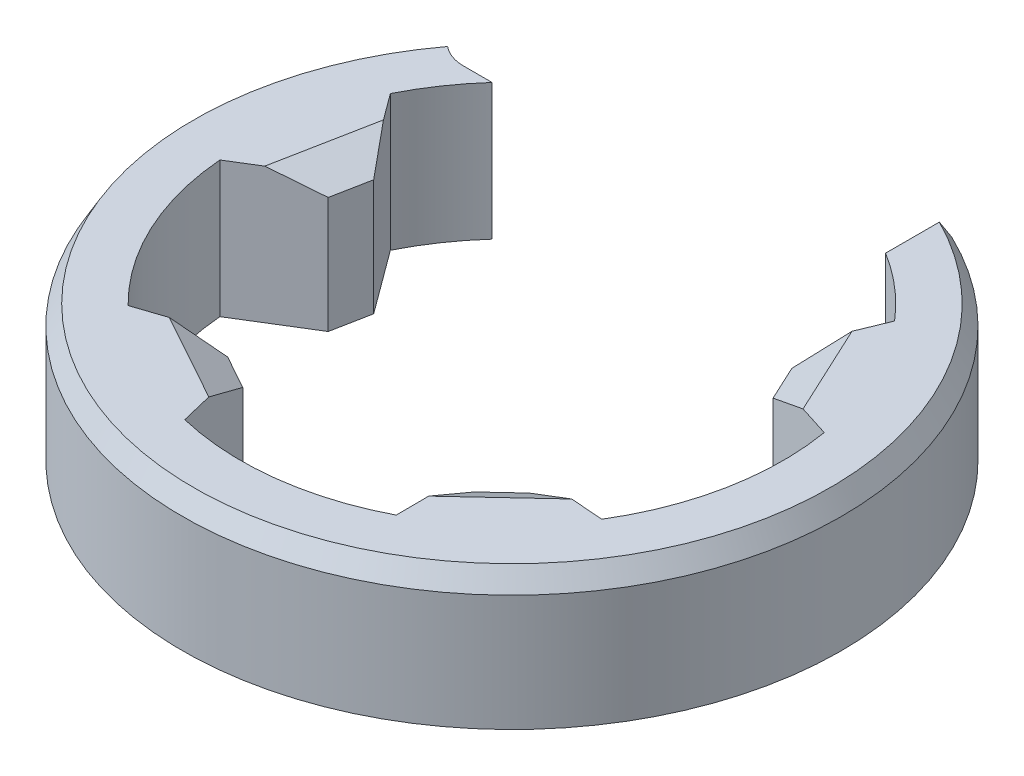
ISO-10303-21;
HEADER;
FILE_DESCRIPTION(('STEP AP214'),'2;1');
FILE_NAME('part.step','',(''),(''),'','','');
FILE_SCHEMA(('AUTOMOTIVE_DESIGN { 1 0 10303 214 1 1 1 1 }'));
ENDSEC;
DATA;
#1=APPLICATION_CONTEXT('core data for automotive mechanical design processes');
#2=APPLICATION_PROTOCOL_DEFINITION('international standard','automotive_design',2000,#1);
#3=PRODUCT_CONTEXT('',#1,'mechanical');
#4=PRODUCT('Part','Part','',(#3));
#5=PRODUCT_RELATED_PRODUCT_CATEGORY('part','',(#4));
#6=PRODUCT_DEFINITION_FORMATION('','',#4);
#7=PRODUCT_DEFINITION_CONTEXT('part definition',#1,'design');
#8=PRODUCT_DEFINITION('design','',#6,#7);
#9=PRODUCT_DEFINITION_SHAPE('','',#8);
#10=(LENGTH_UNIT() NAMED_UNIT(*) SI_UNIT(.MILLI.,.METRE.));
#11=(NAMED_UNIT(*) PLANE_ANGLE_UNIT() SI_UNIT($,.RADIAN.));
#12=(NAMED_UNIT(*) SI_UNIT($,.STERADIAN.) SOLID_ANGLE_UNIT());
#13=UNCERTAINTY_MEASURE_WITH_UNIT(LENGTH_MEASURE(1.E-05),#10,'distance_accuracy_value','');
#14=(GEOMETRIC_REPRESENTATION_CONTEXT(3) GLOBAL_UNCERTAINTY_ASSIGNED_CONTEXT((#13)) GLOBAL_UNIT_ASSIGNED_CONTEXT((#10,
#11,#12)) REPRESENTATION_CONTEXT('',''));
#15=CARTESIAN_POINT('',(0.,0.,0.));
#16=DIRECTION('',(0.,0.,1.));
#17=DIRECTION('',(1.,0.,0.));
#18=AXIS2_PLACEMENT_3D('',#15,#16,#17);
#19=CARTESIAN_POINT('',(22.3156312445688,56.9484850412162,624.040224750273));
#20=DIRECTION('',(0.,1.,0.));
#21=DIRECTION('',(-0.681998360062499,0.,-0.73135370161917));
#22=AXIS2_PLACEMENT_3D('',#19,#20,#21);
#23=PLANE('',#22);
#24=CARTESIAN_POINT('',(22.3156312445688,56.9484850412162,624.040224750273));
#25=DIRECTION('',(0.,-1.,0.));
#26=DIRECTION('',(-0.681998360062499,0.,-0.73135370161917));
#27=AXIS2_PLACEMENT_3D('',#24,#25,#26);
#28=CIRCLE('',#27,32.8452994616208);
#29=CARTESIAN_POINT('',(37.0656312445709,56.9484850412162,594.693143179468));
#30=VERTEX_POINT('',#29);
#31=CARTESIAN_POINT('',(-3.98772197538471,56.9484850412162,604.369248513444));
#32=VERTEX_POINT('',#31);
#33=EDGE_CURVE('E401',#30,#32,#28,.T.);
#34=ORIENTED_EDGE('',*,*,#33,.F.);
#35=DIRECTION('',(0.,0.,1.));
#36=VECTOR('',#35,1.);
#37=CARTESIAN_POINT('',(37.0656312445709,56.9484850412162,624.040224750273));
#38=LINE('',#37,#36);
#39=CARTESIAN_POINT('',(37.0656312445709,56.9484850412162,600.240277271341));
#40=VERTEX_POINT('',#39);
#41=EDGE_CURVE('E51',#30,#40,#38,.T.);
#42=ORIENTED_EDGE('',*,*,#41,.T.);
#43=CARTESIAN_POINT('',(22.3156312445688,56.9484850412162,624.040224750273));
#44=DIRECTION('',(0.,-1.,0.));
#45=DIRECTION('',(-0.681998360062499,0.,-0.73135370161917));
#46=AXIS2_PLACEMENT_3D('',#43,#44,#45);
#47=CIRCLE('',#46,28.);
#48=CARTESIAN_POINT('',(43.5953161836582,56.9484850412162,605.842010307832));
#49=VERTEX_POINT('',#48);
#50=EDGE_CURVE('E265',#40,#49,#47,.T.);
#51=ORIENTED_EDGE('',*,*,#50,.T.);
#52=DIRECTION('',(-0.380734183877205,0.,0.924684530652135));
#53=VECTOR('',#52,1.);
#54=CARTESIAN_POINT('',(40.5028582488572,56.9484850412162,613.352625679645));
#55=LINE('',#54,#53);
#56=CARTESIAN_POINT('',(42.3137816287783,56.9484850412162,608.954457859365));
#57=VERTEX_POINT('',#56);
#58=EDGE_CURVE('E267',#49,#57,#55,.T.);
#59=ORIENTED_EDGE('',*,*,#58,.T.);
#60=DIRECTION('',(-0.422618261740715,0.,-0.906307787036643));
#61=VECTOR('',#60,1.);
#62=CARTESIAN_POINT('',(44.5201720269668,56.9484850412162,613.686077337626));
#63=LINE('',#62,#61);
#64=CARTESIAN_POINT('',(46.7265624251555,56.9484850412162,618.417696815887));
#65=VERTEX_POINT('',#64);
#66=EDGE_CURVE('E368',#65,#57,#63,.T.);
#67=ORIENTED_EDGE('',*,*,#66,.F.);
#68=DIRECTION('',(0.953080662324528,0.,0.302716453307446));
#69=VECTOR('',#68,1.);
#70=CARTESIAN_POINT('',(42.19333129582,56.9484850412162,616.977856827792));
#71=LINE('',#70,#69);
#72=CARTESIAN_POINT('',(49.9345901097687,56.9484850412162,619.436627113382));
#73=VERTEX_POINT('',#72);
#74=EDGE_CURVE('E270',#65,#73,#71,.T.);
#75=ORIENTED_EDGE('',*,*,#74,.T.);
#76=CARTESIAN_POINT('',(22.3156312445688,56.9484850412162,624.040224750273));
#77=DIRECTION('',(0.,-1.,0.));
#78=DIRECTION('',(-0.681998360062499,0.,-0.73135370161917));
#79=AXIS2_PLACEMENT_3D('',#76,#77,#78);
#80=CIRCLE('',#79,28.);
#81=CARTESIAN_POINT('',(46.1989459561127,56.9484850412162,638.654850246308));
#82=VERTEX_POINT('',#81);
#83=EDGE_CURVE('E273',#73,#82,#80,.T.);
#84=ORIENTED_EDGE('',*,*,#83,.T.);
#85=DIRECTION('',(-0.997080581551572,0.,-0.0763564921455948));
#86=VECTOR('',#85,1.);
#87=CARTESIAN_POINT('',(38.1003042091196,56.9484850412162,638.034655764151));
#88=LINE('',#87,#86);
#89=CARTESIAN_POINT('',(42.8428164742633,56.9484850412162,638.397837644557));
#90=VERTEX_POINT('',#89);
#91=EDGE_CURVE('E240',#82,#90,#88,.T.);
#92=ORIENTED_EDGE('',*,*,#91,.T.);
#93=DIRECTION('',(0.73135370161917,0.,-0.681998360062499));
#94=VECTOR('',#93,1.);
#95=CARTESIAN_POINT('',(39.0245910661,56.9484850412162,641.958390439943));
#96=LINE('',#95,#94);
#97=CARTESIAN_POINT('',(35.2063656579367,56.9484850412162,645.51894323533));
#98=VERTEX_POINT('',#97);
#99=EDGE_CURVE('E365',#98,#90,#96,.T.);
#100=ORIENTED_EDGE('',*,*,#99,.F.);
#101=DIRECTION('',(0.00661766616061377,0.,0.999978103007555));
#102=VECTOR('',#101,1.);
#103=CARTESIAN_POINT('',(35.174889402643,56.9484850412162,640.762649204401));
#104=LINE('',#103,#102);
#105=CARTESIAN_POINT('',(35.2286404318252,56.9484850412162,648.884825647246));
#106=VERTEX_POINT('',#105);
#107=EDGE_CURVE('E243',#98,#106,#104,.T.);
#108=ORIENTED_EDGE('',*,*,#107,.T.);
#109=CARTESIAN_POINT('',(22.3156312445688,56.9484850412162,624.040224750273));
#110=DIRECTION('',(0.,-1.,0.));
#111=DIRECTION('',(-0.681998360062499,0.,-0.73135370161917));
#112=AXIS2_PLACEMENT_3D('',#109,#110,#111);
#113=CIRCLE('',#112,28.);
#114=CARTESIAN_POINT('',(15.796646561224,56.9484850412162,651.270774482115));
#115=VERTEX_POINT('',#114);
#116=EDGE_CURVE('E247',#106,#115,#113,.T.);
#117=ORIENTED_EDGE('',*,*,#116,.T.);
#118=DIRECTION('',(-0.235495505044191,0.,-0.971875438059828));
#119=VECTOR('',#118,1.);
#120=CARTESIAN_POINT('',(13.8838686336745,56.9484850412162,643.376857840694));
#121=LINE('',#120,#119);
#122=CARTESIAN_POINT('',(15.0039790256755,56.9484850412162,647.999484407163));
#123=VERTEX_POINT('',#122);
#124=EDGE_CURVE('E250',#115,#123,#121,.T.);
#125=ORIENTED_EDGE('',*,*,#124,.T.);
#126=DIRECTION('',(0.874619707139393,0.,0.484809620246343));
#127=VECTOR('',#126,1.);
#128=CARTESIAN_POINT('',(10.4377955485333,56.9484850412162,645.468407575189));
#129=LINE('',#128,#127);
#130=CARTESIAN_POINT('',(5.87161207139153,56.9484850412162,642.937330743215));
#131=VERTEX_POINT('',#130);
#132=EDGE_CURVE('E362',#131,#123,#129,.T.);
#133=ORIENTED_EDGE('',*,*,#132,.F.);
#134=DIRECTION('',(-0.948990719711073,0.,0.315304002356868));
#135=VECTOR('',#134,1.);
#136=CARTESIAN_POINT('',(10.3853898051169,56.9484850412162,641.437619359708));
#137=LINE('',#136,#135);
#138=CARTESIAN_POINT('',(2.67735095413307,56.9484850412162,643.99863017842));
#139=VERTEX_POINT('',#138);
#140=EDGE_CURVE('E253',#131,#139,#137,.T.);
#141=ORIENTED_EDGE('',*,*,#140,.T.);
#142=CARTESIAN_POINT('',(22.3156312445688,56.9484850412162,624.040224750273));
#143=DIRECTION('',(0.,-1.,0.));
#144=DIRECTION('',(-0.681998360062499,0.,-0.73135370161917));
#145=AXIS2_PLACEMENT_3D('',#142,#143,#144);
#146=CIRCLE('',#145,28.);
#147=CARTESIAN_POINT('',(-5.59663757342227,56.9484850412162,626.255004520861));
#148=VERTEX_POINT('',#147);
#149=EDGE_CURVE('E256',#139,#148,#146,.T.);
#150=ORIENTED_EDGE('',*,*,#149,.T.);
#151=DIRECTION('',(0.85153635523644,0.,-0.524295561406578));
#152=VECTOR('',#151,1.);
#153=CARTESIAN_POINT('',(1.31984240141464,56.9484850412162,621.996490214261));
#154=LINE('',#153,#152);
#155=CARTESIAN_POINT('',(-2.73040357032062,56.9484850412162,624.490248669232));
#156=VERTEX_POINT('',#155);
#157=EDGE_CURVE('E259',#148,#156,#154,.T.);
#158=ORIENTED_EDGE('',*,*,#157,.T.);
#159=DIRECTION('',(-0.190808995376548,0.,0.981627183447664));
#160=VECTOR('',#159,1.);
#161=CARTESIAN_POINT('',(-1.73423474989914,56.9484850412162,619.365404363548));
#162=LINE('',#161,#160);
#163=CARTESIAN_POINT('',(-0.73806592947756,56.9484850412162,614.240560057864));
#164=VERTEX_POINT('',#163);
#165=EDGE_CURVE('E371',#164,#156,#162,.T.);
#166=ORIENTED_EDGE('',*,*,#165,.F.);
#167=DIRECTION('',(-0.59312618595028,0.,-0.80510951276213));
#168=VECTOR('',#167,1.);
#169=CARTESIAN_POINT('',(2.08307838292082,56.9484850412162,618.069981480471));
#170=LINE('',#169,#168);
#171=CARTESIAN_POINT('',(-2.73450264277403,56.9484850412162,611.530596769146));
#172=VERTEX_POINT('',#171);
#173=EDGE_CURVE('E262',#164,#172,#170,.T.);
#174=ORIENTED_EDGE('',*,*,#173,.T.);
#175=CARTESIAN_POINT('',(22.3156312445688,56.9484850412162,624.040224750273));
#176=DIRECTION('',(0.,-1.,0.));
#177=DIRECTION('',(-0.681998360062499,0.,-0.73135370161917));
#178=AXIS2_PLACEMENT_3D('',#175,#176,#177);
#179=CIRCLE('',#178,28.);
#180=CARTESIAN_POINT('',(1.52049960275995,56.9484850412162,605.290224750278));
#181=VERTEX_POINT('',#180);
#182=EDGE_CURVE('E230',#172,#181,#179,.T.);
#183=ORIENTED_EDGE('',*,*,#182,.T.);
#184=DIRECTION('',(-1.,0.,0.));
#185=VECTOR('',#184,1.);
#186=CARTESIAN_POINT('',(22.3156312445688,56.9484850412162,605.290224750278));
#187=LINE('',#186,#185);
#188=CARTESIAN_POINT('',(-1.43436875542909,56.9484850412162,605.290224750278));
#189=VERTEX_POINT('',#188);
#190=EDGE_CURVE('E223',#181,#189,#187,.T.);
#191=ORIENTED_EDGE('',*,*,#190,.T.);
#192=CARTESIAN_POINT('',(-1.43436875542907,56.9484850412162,601.290224750278));
#193=DIRECTION('',(0.,1.,0.));
#194=DIRECTION('',(0.,0.,1.));
#195=AXIS2_PLACEMENT_3D('',#192,#193,#194);
#196=CIRCLE('',#195,4.);
#197=EDGE_CURVE('E208',#189,#32,#196,.F.);
#198=ORIENTED_EDGE('',*,*,#197,.T.);
#199=EDGE_LOOP('',(#34,#42,#51,#59,#67,#75,#84,#92,#100,#108,#117,#125,#133,#141,#150,#158,#166,
#174,#183,#191,#198));
#200=FACE_BOUND('',#199,.T.);
#201=ADVANCED_FACE('F35',(#200),#23,.T.);
#202=CARTESIAN_POINT('',(22.3156312445688,42.9484850412162,624.040224750273));
#203=DIRECTION('',(0.,1.,0.));
#204=DIRECTION('',(-0.681998360062499,0.,-0.73135370161917));
#205=AXIS2_PLACEMENT_3D('',#202,#203,#204);
#206=PLANE('',#205);
#207=DIRECTION('',(0.,0.,1.));
#208=VECTOR('',#207,1.);
#209=CARTESIAN_POINT('',(37.0656312445709,42.9484850412162,624.040224750273));
#210=LINE('',#209,#208);
#211=CARTESIAN_POINT('',(37.0656312445709,42.9484850412162,593.406297480008));
#212=VERTEX_POINT('',#211);
#213=CARTESIAN_POINT('',(37.0656312445709,42.9484850412162,600.240277271341));
#214=VERTEX_POINT('',#213);
#215=EDGE_CURVE('E543',#212,#214,#210,.T.);
#216=ORIENTED_EDGE('',*,*,#215,.F.);
#217=CARTESIAN_POINT('',(22.3156312445688,42.9484850412162,624.040224750273));
#218=DIRECTION('',(0.,-1.,0.));
#219=DIRECTION('',(-0.681998360062499,0.,-0.73135370161917));
#220=AXIS2_PLACEMENT_3D('',#217,#218,#219);
#221=CIRCLE('',#220,34.);
#222=CARTESIAN_POINT('',(-4.77325715483285,42.9484850412162,603.492910441956));
#223=VERTEX_POINT('',#222);
#224=EDGE_CURVE('E354',#212,#223,#221,.T.);
#225=ORIENTED_EDGE('',*,*,#224,.T.);
#226=CARTESIAN_POINT('',(-1.43436875542905,42.9484850412162,601.290224750278));
#227=DIRECTION('',(0.,1.,0.));
#228=DIRECTION('',(0.,0.,1.));
#229=AXIS2_PLACEMENT_3D('',#226,#227,#228);
#230=CIRCLE('',#229,4.);
#231=CARTESIAN_POINT('',(-1.43436875542907,42.9484850412162,605.290224750278));
#232=VERTEX_POINT('',#231);
#233=EDGE_CURVE('E219',#232,#223,#230,.F.);
#234=ORIENTED_EDGE('',*,*,#233,.F.);
#235=DIRECTION('',(-1.,0.,0.));
#236=VECTOR('',#235,1.);
#237=CARTESIAN_POINT('',(22.3156312445688,42.9484850412162,605.290224750278));
#238=LINE('',#237,#236);
#239=CARTESIAN_POINT('',(1.52049960275995,42.9484850412162,605.290224750278));
#240=VERTEX_POINT('',#239);
#241=EDGE_CURVE('E225',#240,#232,#238,.T.);
#242=ORIENTED_EDGE('',*,*,#241,.F.);
#243=CARTESIAN_POINT('',(22.3156312445688,42.9484850412162,624.040224750273));
#244=DIRECTION('',(0.,-1.,0.));
#245=DIRECTION('',(-0.681998360062499,0.,-0.73135370161917));
#246=AXIS2_PLACEMENT_3D('',#243,#244,#245);
#247=CIRCLE('',#246,28.);
#248=CARTESIAN_POINT('',(-2.73450264277403,42.9484850412162,611.530596769146));
#249=VERTEX_POINT('',#248);
#250=EDGE_CURVE('E306',#249,#240,#247,.T.);
#251=ORIENTED_EDGE('',*,*,#250,.F.);
#252=DIRECTION('',(-0.59312618595028,0.,-0.80510951276213));
#253=VECTOR('',#252,1.);
#254=CARTESIAN_POINT('',(2.08307838292082,42.9484850412162,618.069981480471));
#255=LINE('',#254,#253);
#256=CARTESIAN_POINT('',(2.08307838292082,42.9484850412162,618.069981480471));
#257=VERTEX_POINT('',#256);
#258=EDGE_CURVE('E303',#257,#249,#255,.T.);
#259=ORIENTED_EDGE('',*,*,#258,.F.);
#260=DIRECTION('',(0.190808995376548,0.,-0.981627183447663));
#261=VECTOR('',#260,1.);
#262=CARTESIAN_POINT('',(2.08307838292082,42.9484850412162,618.069981480471));
#263=LINE('',#262,#261);
#264=CARTESIAN_POINT('',(1.31984240141464,42.9484850412162,621.996490214261));
#265=VERTEX_POINT('',#264);
#266=EDGE_CURVE('E300',#265,#257,#263,.T.);
#267=ORIENTED_EDGE('',*,*,#266,.F.);
#268=DIRECTION('',(0.85153635523644,0.,-0.524295561406578));
#269=VECTOR('',#268,1.);
#270=CARTESIAN_POINT('',(1.31984240141464,42.9484850412162,621.996490214261));
#271=LINE('',#270,#269);
#272=CARTESIAN_POINT('',(-5.59663757342227,42.9484850412162,626.255004520861));
#273=VERTEX_POINT('',#272);
#274=EDGE_CURVE('E297',#273,#265,#271,.T.);
#275=ORIENTED_EDGE('',*,*,#274,.F.);
#276=CARTESIAN_POINT('',(22.3156312445688,42.9484850412162,624.040224750273));
#277=DIRECTION('',(0.,-1.,0.));
#278=DIRECTION('',(-0.681998360062499,0.,-0.73135370161917));
#279=AXIS2_PLACEMENT_3D('',#276,#277,#278);
#280=CIRCLE('',#279,28.);
#281=CARTESIAN_POINT('',(2.67735095413307,42.9484850412162,643.99863017842));
#282=VERTEX_POINT('',#281);
#283=EDGE_CURVE('E294',#282,#273,#280,.T.);
#284=ORIENTED_EDGE('',*,*,#283,.F.);
#285=DIRECTION('',(-0.948990719711073,0.,0.315304002356868));
#286=VECTOR('',#285,1.);
#287=CARTESIAN_POINT('',(10.3853898051169,42.9484850412162,641.437619359708));
#288=LINE('',#287,#286);
#289=CARTESIAN_POINT('',(10.3853898051169,42.9484850412162,641.437619359708));
#290=VERTEX_POINT('',#289);
#291=EDGE_CURVE('E291',#290,#282,#288,.T.);
#292=ORIENTED_EDGE('',*,*,#291,.F.);
#293=DIRECTION('',(-0.874619707139393,0.,-0.484809620246343));
#294=VECTOR('',#293,1.);
#295=CARTESIAN_POINT('',(10.3853898051169,42.9484850412162,641.437619359708));
#296=LINE('',#295,#294);
#297=CARTESIAN_POINT('',(13.8838686336745,42.9484850412162,643.376857840694));
#298=VERTEX_POINT('',#297);
#299=EDGE_CURVE('E288',#298,#290,#296,.T.);
#300=ORIENTED_EDGE('',*,*,#299,.F.);
#301=DIRECTION('',(-0.235495505044191,0.,-0.971875438059828));
#302=VECTOR('',#301,1.);
#303=CARTESIAN_POINT('',(13.8838686336745,42.9484850412162,643.376857840694));
#304=LINE('',#303,#302);
#305=CARTESIAN_POINT('',(15.796646561224,42.9484850412162,651.270774482115));
#306=VERTEX_POINT('',#305);
#307=EDGE_CURVE('E285',#306,#298,#304,.T.);
#308=ORIENTED_EDGE('',*,*,#307,.F.);
#309=CARTESIAN_POINT('',(22.3156312445688,42.9484850412162,624.040224750273));
#310=DIRECTION('',(0.,-1.,0.));
#311=DIRECTION('',(-0.681998360062499,0.,-0.73135370161917));
#312=AXIS2_PLACEMENT_3D('',#309,#310,#311);
#313=CIRCLE('',#312,28.);
#314=CARTESIAN_POINT('',(35.2286404318252,42.9484850412162,648.884825647246));
#315=VERTEX_POINT('',#314);
#316=EDGE_CURVE('E282',#315,#306,#313,.T.);
#317=ORIENTED_EDGE('',*,*,#316,.F.);
#318=DIRECTION('',(0.00661766616061377,0.,0.999978103007555));
#319=VECTOR('',#318,1.);
#320=CARTESIAN_POINT('',(35.174889402643,42.9484850412162,640.762649204401));
#321=LINE('',#320,#319);
#322=CARTESIAN_POINT('',(35.174889402643,42.9484850412162,640.762649204401));
#323=VERTEX_POINT('',#322);
#324=EDGE_CURVE('E279',#323,#315,#321,.T.);
#325=ORIENTED_EDGE('',*,*,#324,.F.);
#326=DIRECTION('',(-0.73135370161917,0.,0.681998360062499));
#327=VECTOR('',#326,1.);
#328=CARTESIAN_POINT('',(35.174889402643,42.9484850412162,640.762649204401));
#329=LINE('',#328,#327);
#330=CARTESIAN_POINT('',(38.1003042091196,42.9484850412162,638.034655764151));
#331=VERTEX_POINT('',#330);
#332=EDGE_CURVE('E234',#331,#323,#329,.T.);
#333=ORIENTED_EDGE('',*,*,#332,.F.);
#334=DIRECTION('',(-0.997080581551572,0.,-0.0763564921455948));
#335=VECTOR('',#334,1.);
#336=CARTESIAN_POINT('',(38.1003042091196,42.9484850412162,638.034655764151));
#337=LINE('',#336,#335);
#338=CARTESIAN_POINT('',(46.1989459561127,42.9484850412162,638.654850246308));
#339=VERTEX_POINT('',#338);
#340=EDGE_CURVE('E231',#339,#331,#337,.T.);
#341=ORIENTED_EDGE('',*,*,#340,.F.);
#342=CARTESIAN_POINT('',(22.3156312445688,42.9484850412162,624.040224750273));
#343=DIRECTION('',(0.,-1.,0.));
#344=DIRECTION('',(-0.681998360062499,0.,-0.73135370161917));
#345=AXIS2_PLACEMENT_3D('',#342,#343,#344);
#346=CIRCLE('',#345,28.);
#347=CARTESIAN_POINT('',(49.9345901097687,42.9484850412162,619.436627113381));
#348=VERTEX_POINT('',#347);
#349=EDGE_CURVE('E244',#348,#339,#346,.T.);
#350=ORIENTED_EDGE('',*,*,#349,.F.);
#351=DIRECTION('',(0.953080662324528,0.,0.302716453307446));
#352=VECTOR('',#351,1.);
#353=CARTESIAN_POINT('',(42.19333129582,42.9484850412162,616.977856827792));
#354=LINE('',#353,#352);
#355=CARTESIAN_POINT('',(42.19333129582,42.9484850412162,616.977856827792));
#356=VERTEX_POINT('',#355);
#357=EDGE_CURVE('E317',#356,#348,#354,.T.);
#358=ORIENTED_EDGE('',*,*,#357,.F.);
#359=DIRECTION('',(0.422618261740715,0.,0.906307787036643));
#360=VECTOR('',#359,1.);
#361=CARTESIAN_POINT('',(42.19333129582,42.9484850412162,616.977856827792));
#362=LINE('',#361,#360);
#363=CARTESIAN_POINT('',(40.5028582488572,42.9484850412162,613.352625679645));
#364=VERTEX_POINT('',#363);
#365=EDGE_CURVE('E314',#364,#356,#362,.T.);
#366=ORIENTED_EDGE('',*,*,#365,.F.);
#367=DIRECTION('',(-0.380734183877205,0.,0.924684530652135));
#368=VECTOR('',#367,1.);
#369=CARTESIAN_POINT('',(40.5028582488572,42.9484850412162,613.352625679645));
#370=LINE('',#369,#368);
#371=CARTESIAN_POINT('',(43.5953161836582,42.9484850412162,605.842010307832));
#372=VERTEX_POINT('',#371);
#373=EDGE_CURVE('E311',#372,#364,#370,.T.);
#374=ORIENTED_EDGE('',*,*,#373,.F.);
#375=CARTESIAN_POINT('',(22.3156312445688,42.9484850412162,624.040224750273));
#376=DIRECTION('',(0.,-1.,0.));
#377=DIRECTION('',(-0.681998360062499,0.,-0.73135370161917));
#378=AXIS2_PLACEMENT_3D('',#375,#376,#377);
#379=CIRCLE('',#378,28.);
#380=EDGE_CURVE('E309',#214,#372,#379,.T.);
#381=ORIENTED_EDGE('',*,*,#380,.F.);
#382=EDGE_LOOP('',(#216,#225,#234,#242,#251,#259,#267,#275,#284,#292,#300,#308,#317,#325,#333,
#341,#350,#358,#366,#374,#381));
#383=FACE_BOUND('',#382,.T.);
#384=ADVANCED_FACE('F494',(#383),#206,.F.);
#385=CARTESIAN_POINT('',(22.3156312445688,56.9484850412162,624.040224750273));
#386=DIRECTION('',(0.,-1.,0.));
#387=DIRECTION('',(0.681998360062499,0.,0.73135370161917));
#388=AXIS2_PLACEMENT_3D('',#385,#386,#387);
#389=CYLINDRICAL_SURFACE('',#388,34.);
#390=DIRECTION('',(0.,-1.,0.));
#391=VECTOR('',#390,1.);
#392=CARTESIAN_POINT('',(37.0656312445709,56.9484850412162,593.406297480008));
#393=LINE('',#392,#391);
#394=CARTESIAN_POINT('',(37.0656312445709,54.9484850412162,593.406297480008));
#395=VERTEX_POINT('',#394);
#396=EDGE_CURVE('E218',#395,#212,#393,.T.);
#397=ORIENTED_EDGE('',*,*,#396,.F.);
#398=CARTESIAN_POINT('',(22.3156312445688,54.9484850412162,624.040224750273));
#399=DIRECTION('',(0.,-1.,0.));
#400=DIRECTION('',(-0.681998360062499,0.,-0.73135370161917));
#401=AXIS2_PLACEMENT_3D('',#398,#399,#400);
#402=CIRCLE('',#401,34.);
#403=CARTESIAN_POINT('',(-4.77325715483285,54.9484850412162,603.492910441956));
#404=VERTEX_POINT('',#403);
#405=EDGE_CURVE('E403',#404,#395,#402,.F.);
#406=ORIENTED_EDGE('',*,*,#405,.F.);
#407=DIRECTION('',(0.,-1.,0.));
#408=VECTOR('',#407,1.);
#409=CARTESIAN_POINT('',(-4.77325715483287,46.0534867100374,603.492910441956));
#410=LINE('',#409,#408);
#411=EDGE_CURVE('E59',#223,#404,#410,.F.);
#412=ORIENTED_EDGE('',*,*,#411,.F.);
#413=ORIENTED_EDGE('',*,*,#224,.F.);
#414=EDGE_LOOP('',(#397,#406,#412,#413));
#415=FACE_BOUND('',#414,.T.);
#416=ADVANCED_FACE('F447',(#415),#389,.T.);
#417=CARTESIAN_POINT('',(22.3156312445688,56.9484850412162,624.040224750273));
#418=DIRECTION('',(0.,-1.,0.));
#419=DIRECTION('',(0.681998360062499,0.,0.73135370161917));
#420=AXIS2_PLACEMENT_3D('',#417,#418,#419);
#421=CYLINDRICAL_SURFACE('',#420,28.);
#422=ORIENTED_EDGE('',*,*,#250,.T.);
#423=DIRECTION('',(0.,-1.,0.));
#424=VECTOR('',#423,1.);
#425=CARTESIAN_POINT('',(1.52049960275995,56.9484850412162,605.290224750278));
#426=LINE('',#425,#424);
#427=EDGE_CURVE('E11',#240,#181,#426,.F.);
#428=ORIENTED_EDGE('',*,*,#427,.T.);
#429=ORIENTED_EDGE('',*,*,#182,.F.);
#430=DIRECTION('',(0.,-1.,0.));
#431=VECTOR('',#430,1.);
#432=CARTESIAN_POINT('',(-2.73450264277403,56.9484850412162,611.530596769146));
#433=LINE('',#432,#431);
#434=EDGE_CURVE('E332',#172,#249,#433,.T.);
#435=ORIENTED_EDGE('',*,*,#434,.T.);
#436=EDGE_LOOP('',(#422,#428,#429,#435));
#437=FACE_BOUND('',#436,.T.);
#438=ADVANCED_FACE('F443',(#437),#421,.F.);
#439=CARTESIAN_POINT('',(22.3156312445688,56.9484850412162,624.040224750273));
#440=DIRECTION('',(0.,-1.,0.));
#441=DIRECTION('',(0.681998360062499,0.,0.73135370161917));
#442=AXIS2_PLACEMENT_3D('',#439,#440,#441);
#443=CYLINDRICAL_SURFACE('',#442,28.);
#444=ORIENTED_EDGE('',*,*,#50,.F.);
#445=DIRECTION('',(0.,-1.,0.));
#446=VECTOR('',#445,1.);
#447=CARTESIAN_POINT('',(37.0656312445709,56.9484850412162,600.240277271341));
#448=LINE('',#447,#446);
#449=EDGE_CURVE('E236',#40,#214,#448,.T.);
#450=ORIENTED_EDGE('',*,*,#449,.T.);
#451=ORIENTED_EDGE('',*,*,#380,.T.);
#452=DIRECTION('',(0.,-1.,0.));
#453=VECTOR('',#452,1.);
#454=CARTESIAN_POINT('',(43.5953161836582,56.9484850412162,605.842010307832));
#455=LINE('',#454,#453);
#456=EDGE_CURVE('E329',#49,#372,#455,.T.);
#457=ORIENTED_EDGE('',*,*,#456,.F.);
#458=EDGE_LOOP('',(#444,#450,#451,#457));
#459=FACE_BOUND('',#458,.T.);
#460=ADVANCED_FACE('F440',(#459),#443,.F.);
#461=CARTESIAN_POINT('',(22.3156312445688,56.9484850412162,624.040224750273));
#462=DIRECTION('',(0.,-1.,0.));
#463=DIRECTION('',(0.681998360062499,0.,0.73135370161917));
#464=AXIS2_PLACEMENT_3D('',#461,#462,#463);
#465=CONICAL_SURFACE('',#464,32.8452994616208,0.523598775598276);
#466=ORIENTED_EDGE('',*,*,#405,.T.);
#467=CARTESIAN_POINT('',(37.0656312445709,38.1419945267289,582.901314072594));
#468=CARTESIAN_POINT('',(37.0656312445709,38.8923659295519,583.361548630101));
#469=CARTESIAN_POINT('',(37.0656312445709,39.6423480944682,583.822417624311));
#470=CARTESIAN_POINT('',(37.0656312445709,41.1414438045792,584.745568160405));
#471=CARTESIAN_POINT('',(37.0656312445709,41.8905573486833,585.207849704061));
#472=CARTESIAN_POINT('',(37.0656312445709,44.1364419605264,586.597017627716));
#473=CARTESIAN_POINT('',(37.0656312445709,45.6317720972647,587.526236547414));
#474=CARTESIAN_POINT('',(37.0656312445709,48.6170320450763,589.392003864789));
#475=CARTESIAN_POINT('',(37.0656312445709,50.1069637596677,590.32854921527));
#476=CARTESIAN_POINT('',(37.0656312445709,53.0807382655779,592.21134757864));
#477=CARTESIAN_POINT('',(37.0656312445709,54.564580921937,593.157600805089));
#478=CARTESIAN_POINT('',(37.0656312445709,56.7846183912924,594.586547052922));
#479=CARTESIAN_POINT('',(37.0656312445709,57.523828487297,595.064556548252));
#480=CARTESIAN_POINT('',(37.0656312445709,58.9999116972853,596.024170333906));
#481=CARTESIAN_POINT('',(37.0656312445709,59.7367848146333,596.505774619052));
#482=CARTESIAN_POINT('',(37.0656312445709,61.207767505361,597.473095591033));
#483=CARTESIAN_POINT('',(37.0656312445709,61.9418772357624,597.95881203895));
#484=CARTESIAN_POINT('',(37.0656312445709,63.406898181419,598.935057617021));
#485=CARTESIAN_POINT('',(37.0656312445709,64.1378093779813,599.425586775247));
#486=CARTESIAN_POINT('',(37.0656312445709,65.5961265333153,600.41248450715));
#487=CARTESIAN_POINT('',(37.0656312445709,66.3235309055025,600.908855427666));
#488=CARTESIAN_POINT('',(37.0656312445709,67.7737354349187,601.908257419427));
#489=CARTESIAN_POINT('',(37.0656312445709,68.4965356718466,602.411288374919));
#490=CARTESIAN_POINT('',(37.0656312445709,69.9366746606567,603.425418536563));
#491=CARTESIAN_POINT('',(37.0656312445709,70.6540123353128,603.936519275986));
#492=CARTESIAN_POINT('',(37.0656312445709,71.7248066981962,604.710424455493));
#493=CARTESIAN_POINT('',(37.0656312445709,72.0808802192152,604.96960985945));
#494=CARTESIAN_POINT('',(37.0656312445709,72.7910627957761,605.490666700104));
#495=CARTESIAN_POINT('',(37.0656312445709,73.1451718267792,605.752538170238));
#496=CARTESIAN_POINT('',(37.0656312445709,73.498184357252,606.015885923368));
#497=B_SPLINE_CURVE_WITH_KNOTS('',3,(#467,#468,#469,#470,#471,#472,#473,#474,#475,#476,#477,
#478,#479,#480,#481,#482,#483,#484,#485,#486,#487,#488,#489,#490,#491,#492,#493,#494,#495,#496),
.UNSPECIFIED.,.F.,.F.,(4,2,2,2,2,2,2,2,2,2,2,2,2,2,4),(0.,2.64080559966626,5.28161451160654,
10.5631792435366,15.8426531263486,21.122243399851,23.7631292346667,26.404011265961,
29.0447409002275,31.6854859469953,34.3273307743732,36.9691297456979,39.6114368518069,
40.9326708343304,42.2539212836348),.UNSPECIFIED.);
#498=EDGE_CURVE('E44',#395,#30,#497,.T.);
#499=ORIENTED_EDGE('',*,*,#498,.T.);
#500=ORIENTED_EDGE('',*,*,#33,.T.);
#501=CARTESIAN_POINT('',(-3.98763297844868,56.9486850412162,604.369322314086));
#502=CARTESIAN_POINT('',(-4.0622628161054,56.7809534233662,604.307421623902));
#503=CARTESIAN_POINT('',(-4.13476304497253,56.6132951513268,604.242738329229));
#504=CARTESIAN_POINT('',(-4.27519174089753,56.27859539579,604.107885437387));
#505=CARTESIAN_POINT('',(-4.34312665171711,56.111553371444,604.037723888613));
#506=CARTESIAN_POINT('',(-4.47433014508419,55.7780672666773,603.891813277977));
#507=CARTESIAN_POINT('',(-4.53759862319315,55.6116231997187,603.816064091136));
#508=CARTESIAN_POINT('',(-4.65924261112358,55.2793587637568,603.658780489294));
#509=CARTESIAN_POINT('',(-4.71761091952312,55.1135396433137,603.577237873927));
#510=CARTESIAN_POINT('',(-4.7733245697584,54.9482850412162,603.492808249253));
#511=B_SPLINE_CURVE_WITH_KNOTS('',3,(#501,#502,#503,#504,#505,#506,#507,#508,#509,#510),
.UNSPECIFIED.,.F.,.F.,(4,2,2,2,4),(0.,0.58119557346694,1.16155279174039,1.74192299493999,
2.32313171606623),.UNSPECIFIED.);
#512=EDGE_CURVE('E213',#32,#404,#511,.T.);
#513=ORIENTED_EDGE('',*,*,#512,.T.);
#514=EDGE_LOOP('',(#466,#499,#500,#513));
#515=FACE_BOUND('',#514,.T.);
#516=ADVANCED_FACE('F37',(#515),#465,.T.);
#517=CARTESIAN_POINT('',(38.1003042091196,56.9484850412162,638.034655764151));
#518=DIRECTION('',(0.0763564921455949,0.,-0.997080581551572));
#519=DIRECTION('',(-0.997080581551572,0.,-0.0763564921455949));
#520=AXIS2_PLACEMENT_3D('',#517,#518,#519);
#521=PLANE('',#520);
#522=ORIENTED_EDGE('',*,*,#91,.F.);
#523=DIRECTION('',(0.,-1.,0.));
#524=VECTOR('',#523,1.);
#525=CARTESIAN_POINT('',(46.1989459561127,56.9484850412162,638.654850246308));
#526=LINE('',#525,#524);
#527=EDGE_CURVE('E275',#82,#339,#526,.T.);
#528=ORIENTED_EDGE('',*,*,#527,.T.);
#529=ORIENTED_EDGE('',*,*,#340,.T.);
#530=DIRECTION('',(0.,-1.,0.));
#531=VECTOR('',#530,1.);
#532=CARTESIAN_POINT('',(38.1003042091196,56.9484850412162,638.034655764151));
#533=LINE('',#532,#531);
#534=CARTESIAN_POINT('',(38.1003042091196,54.9277590990526,638.034655764151));
#535=VERTEX_POINT('',#534);
#536=EDGE_CURVE('E352',#535,#331,#533,.T.);
#537=ORIENTED_EDGE('',*,*,#536,.F.);
#538=DIRECTION('',(0.917695703500949,0.391018812688363,0.0702771933110725));
#539=VECTOR('',#538,1.);
#540=CARTESIAN_POINT('',(38.8254139979804,55.2367194304864,638.090184716296));
#541=LINE('',#540,#539);
#542=EDGE_CURVE('E390',#90,#535,#541,.F.);
#543=ORIENTED_EDGE('',*,*,#542,.F.);
#544=EDGE_LOOP('',(#522,#528,#529,#537,#543));
#545=FACE_BOUND('',#544,.T.);
#546=ADVANCED_FACE('F487',(#545),#521,.T.);
#547=CARTESIAN_POINT('',(35.174889402643,56.9484850412162,640.762649204401));
#548=DIRECTION('',(-0.681998360062499,0.,-0.73135370161917));
#549=DIRECTION('',(-0.73135370161917,0.,0.681998360062499));
#550=AXIS2_PLACEMENT_3D('',#547,#548,#549);
#551=PLANE('',#550);
#552=ORIENTED_EDGE('',*,*,#536,.T.);
#553=ORIENTED_EDGE('',*,*,#332,.T.);
#554=DIRECTION('',(0.,-1.,0.));
#555=VECTOR('',#554,1.);
#556=CARTESIAN_POINT('',(35.174889402643,56.9484850412162,640.762649204401));
#557=LINE('',#556,#555);
#558=CARTESIAN_POINT('',(35.174889402643,54.9277590990526,640.762649204401));
#559=VERTEX_POINT('',#558);
#560=EDGE_CURVE('E350',#559,#323,#557,.T.);
#561=ORIENTED_EDGE('',*,*,#560,.F.);
#562=DIRECTION('',(-0.73135370161917,0.,0.681998360062499));
#563=VECTOR('',#562,1.);
#564=CARTESIAN_POINT('',(35.174889402643,54.9277590990526,640.762649204401));
#565=LINE('',#564,#563);
#566=EDGE_CURVE('E385',#535,#559,#565,.T.);
#567=ORIENTED_EDGE('',*,*,#566,.F.);
#568=EDGE_LOOP('',(#552,#553,#561,#567));
#569=FACE_BOUND('',#568,.T.);
#570=ADVANCED_FACE('F483',(#569),#551,.T.);
#571=CARTESIAN_POINT('',(35.174889402643,56.9484850412162,640.762649204401));
#572=DIRECTION('',(-0.999978103007554,0.,0.00661766616061382));
#573=DIRECTION('',(0.00661766616061382,0.,0.999978103007554));
#574=AXIS2_PLACEMENT_3D('',#571,#572,#573);
#575=PLANE('',#574);
#576=ORIENTED_EDGE('',*,*,#560,.T.);
#577=ORIENTED_EDGE('',*,*,#324,.T.);
#578=DIRECTION('',(0.,-1.,0.));
#579=VECTOR('',#578,1.);
#580=CARTESIAN_POINT('',(35.2286404318252,56.9484850412162,648.884825647246));
#581=LINE('',#580,#579);
#582=EDGE_CURVE('E348',#106,#315,#581,.T.);
#583=ORIENTED_EDGE('',*,*,#582,.F.);
#584=ORIENTED_EDGE('',*,*,#107,.F.);
#585=DIRECTION('',(-0.00609078535392654,-0.391018812688363,-0.92036253208046));
#586=VECTOR('',#585,1.);
#587=CARTESIAN_POINT('',(35.1797019871033,55.2367194304864,641.489866166152));
#588=LINE('',#587,#586);
#589=EDGE_CURVE('E388',#559,#98,#588,.F.);
#590=ORIENTED_EDGE('',*,*,#589,.F.);
#591=EDGE_LOOP('',(#576,#577,#583,#584,#590));
#592=FACE_BOUND('',#591,.T.);
#593=ADVANCED_FACE('F479',(#592),#575,.T.);
#594=CARTESIAN_POINT('',(22.3156312445688,56.9484850412162,624.040224750273));
#595=DIRECTION('',(0.,-1.,0.));
#596=DIRECTION('',(0.681998360062499,0.,0.73135370161917));
#597=AXIS2_PLACEMENT_3D('',#594,#595,#596);
#598=CYLINDRICAL_SURFACE('',#597,28.);
#599=ORIENTED_EDGE('',*,*,#316,.T.);
#600=DIRECTION('',(0.,-1.,0.));
#601=VECTOR('',#600,1.);
#602=CARTESIAN_POINT('',(15.796646561224,56.9484850412162,651.270774482115));
#603=LINE('',#602,#601);
#604=EDGE_CURVE('E346',#115,#306,#603,.T.);
#605=ORIENTED_EDGE('',*,*,#604,.F.);
#606=ORIENTED_EDGE('',*,*,#116,.F.);
#607=ORIENTED_EDGE('',*,*,#582,.T.);
#608=EDGE_LOOP('',(#599,#605,#606,#607));
#609=FACE_BOUND('',#608,.T.);
#610=ADVANCED_FACE('F475',(#609),#598,.F.);
#611=CARTESIAN_POINT('',(13.8838686336745,56.9484850412162,643.376857840694));
#612=DIRECTION('',(0.971875438059828,0.,-0.235495505044191));
#613=DIRECTION('',(-0.235495505044191,0.,-0.971875438059828));
#614=AXIS2_PLACEMENT_3D('',#611,#612,#613);
#615=PLANE('',#614);
#616=ORIENTED_EDGE('',*,*,#124,.F.);
#617=ORIENTED_EDGE('',*,*,#604,.T.);
#618=ORIENTED_EDGE('',*,*,#307,.T.);
#619=DIRECTION('',(0.,-1.,0.));
#620=VECTOR('',#619,1.);
#621=CARTESIAN_POINT('',(13.8838686336745,56.9484850412162,643.376857840694));
#622=LINE('',#621,#620);
#623=CARTESIAN_POINT('',(13.8838686336745,54.9277590990525,643.376857840694));
#624=VERTEX_POINT('',#623);
#625=EDGE_CURVE('E344',#624,#298,#622,.T.);
#626=ORIENTED_EDGE('',*,*,#625,.F.);
#627=DIRECTION('',(0.216745985401244,0.391018812688358,0.894497325840738));
#628=VECTOR('',#627,1.);
#629=CARTESIAN_POINT('',(14.0551287094394,55.2367194304864,644.083637620312));
#630=LINE('',#629,#628);
#631=EDGE_CURVE('E398',#123,#624,#630,.F.);
#632=ORIENTED_EDGE('',*,*,#631,.F.);
#633=EDGE_LOOP('',(#616,#617,#618,#626,#632));
#634=FACE_BOUND('',#633,.T.);
#635=ADVANCED_FACE('F471',(#634),#615,.T.);
#636=CARTESIAN_POINT('',(10.3853898051169,56.9484850412162,641.437619359708));
#637=DIRECTION('',(0.484809620246343,0.,-0.874619707139393));
#638=DIRECTION('',(-0.874619707139393,0.,-0.484809620246343));
#639=AXIS2_PLACEMENT_3D('',#636,#637,#638);
#640=PLANE('',#639);
#641=ORIENTED_EDGE('',*,*,#625,.T.);
#642=ORIENTED_EDGE('',*,*,#299,.T.);
#643=DIRECTION('',(0.,-1.,0.));
#644=VECTOR('',#643,1.);
#645=CARTESIAN_POINT('',(10.3853898051169,56.9484850412162,641.437619359708));
#646=LINE('',#645,#644);
#647=CARTESIAN_POINT('',(10.3853898051169,54.9277590990525,641.437619359708));
#648=VERTEX_POINT('',#647);
#649=EDGE_CURVE('E342',#648,#290,#646,.T.);
#650=ORIENTED_EDGE('',*,*,#649,.F.);
#651=DIRECTION('',(-0.874619707139393,0.,-0.484809620246343));
#652=VECTOR('',#651,1.);
#653=CARTESIAN_POINT('',(10.3853898051169,54.9277590990525,641.437619359708));
#654=LINE('',#653,#652);
#655=EDGE_CURVE('E393',#624,#648,#654,.T.);
#656=ORIENTED_EDGE('',*,*,#655,.F.);
#657=EDGE_LOOP('',(#641,#642,#650,#656));
#658=FACE_BOUND('',#657,.T.);
#659=ADVANCED_FACE('F467',(#658),#640,.T.);
#660=CARTESIAN_POINT('',(10.3853898051169,56.9484850412162,641.437619359708));
#661=DIRECTION('',(-0.315304002356868,0.,-0.948990719711073));
#662=DIRECTION('',(-0.948990719711073,0.,0.315304002356868));
#663=AXIS2_PLACEMENT_3D('',#660,#661,#662);
#664=PLANE('',#663);
#665=ORIENTED_EDGE('',*,*,#649,.T.);
#666=ORIENTED_EDGE('',*,*,#291,.T.);
#667=DIRECTION('',(0.,-1.,0.));
#668=VECTOR('',#667,1.);
#669=CARTESIAN_POINT('',(2.67735095413307,56.9484850412162,643.99863017842));
#670=LINE('',#669,#668);
#671=EDGE_CURVE('E340',#139,#282,#670,.T.);
#672=ORIENTED_EDGE('',*,*,#671,.F.);
#673=ORIENTED_EDGE('',*,*,#140,.F.);
#674=DIRECTION('',(0.873434627305577,-0.391018812688363,-0.290200344499021));
#675=VECTOR('',#674,1.);
#676=CARTESIAN_POINT('',(9.69525254526799,55.2367194304864,641.666918799298));
#677=LINE('',#676,#675);
#678=EDGE_CURVE('E396',#648,#131,#677,.F.);
#679=ORIENTED_EDGE('',*,*,#678,.F.);
#680=EDGE_LOOP('',(#665,#666,#672,#673,#679));
#681=FACE_BOUND('',#680,.T.);
#682=ADVANCED_FACE('F463',(#681),#664,.T.);
#683=CARTESIAN_POINT('',(22.3156312445688,56.9484850412162,624.040224750273));
#684=DIRECTION('',(0.,-1.,0.));
#685=DIRECTION('',(0.681998360062499,0.,0.73135370161917));
#686=AXIS2_PLACEMENT_3D('',#683,#684,#685);
#687=CYLINDRICAL_SURFACE('',#686,28.);
#688=ORIENTED_EDGE('',*,*,#283,.T.);
#689=DIRECTION('',(0.,-1.,0.));
#690=VECTOR('',#689,1.);
#691=CARTESIAN_POINT('',(-5.59663757342227,56.9484850412162,626.255004520861));
#692=LINE('',#691,#690);
#693=EDGE_CURVE('E338',#148,#273,#692,.T.);
#694=ORIENTED_EDGE('',*,*,#693,.F.);
#695=ORIENTED_EDGE('',*,*,#149,.F.);
#696=ORIENTED_EDGE('',*,*,#671,.T.);
#697=EDGE_LOOP('',(#688,#694,#695,#696));
#698=FACE_BOUND('',#697,.T.);
#699=ADVANCED_FACE('F459',(#698),#687,.F.);
#700=CARTESIAN_POINT('',(1.31984240141464,56.9484850412162,621.996490214261));
#701=DIRECTION('',(0.524295561406579,0.,0.85153635523644));
#702=DIRECTION('',(0.85153635523644,0.,-0.524295561406579));
#703=AXIS2_PLACEMENT_3D('',#700,#701,#702);
#704=PLANE('',#703);
#705=ORIENTED_EDGE('',*,*,#157,.F.);
#706=ORIENTED_EDGE('',*,*,#693,.T.);
#707=ORIENTED_EDGE('',*,*,#274,.T.);
#708=DIRECTION('',(0.,-1.,0.));
#709=VECTOR('',#708,1.);
#710=CARTESIAN_POINT('',(1.31984240141464,56.9484850412162,621.996490214261));
#711=LINE('',#710,#709);
#712=CARTESIAN_POINT('',(1.31984240141464,54.9277590990525,621.996490214261));
#713=VERTEX_POINT('',#712);
#714=EDGE_CURVE('E336',#713,#265,#711,.T.);
#715=ORIENTED_EDGE('',*,*,#714,.F.);
#716=DIRECTION('',(-0.783739317597894,0.391018812688361,0.482552556904398));
#717=VECTOR('',#716,1.);
#718=CARTESIAN_POINT('',(0.700577160292426,55.2367194304864,622.377775188481));
#719=LINE('',#718,#717);
#720=EDGE_CURVE('E374',#156,#713,#719,.F.);
#721=ORIENTED_EDGE('',*,*,#720,.F.);
#722=EDGE_LOOP('',(#705,#706,#707,#715,#721));
#723=FACE_BOUND('',#722,.T.);
#724=ADVANCED_FACE('F455',(#723),#704,.T.);
#725=CARTESIAN_POINT('',(2.08307838292082,56.9484850412162,618.069981480471));
#726=DIRECTION('',(0.981627183447663,0.,0.190808995376548));
#727=DIRECTION('',(0.190808995376548,0.,-0.981627183447663));
#728=AXIS2_PLACEMENT_3D('',#725,#726,#727);
#729=PLANE('',#728);
#730=ORIENTED_EDGE('',*,*,#714,.T.);
#731=ORIENTED_EDGE('',*,*,#266,.T.);
#732=DIRECTION('',(0.,-1.,0.));
#733=VECTOR('',#732,1.);
#734=CARTESIAN_POINT('',(2.08307838292082,56.9484850412162,618.069981480471));
#735=LINE('',#734,#733);
#736=CARTESIAN_POINT('',(2.08307838292082,54.9277590990525,618.069981480471));
#737=VERTEX_POINT('',#736);
#738=EDGE_CURVE('E334',#737,#257,#735,.T.);
#739=ORIENTED_EDGE('',*,*,#738,.F.);
#740=DIRECTION('',(0.190808995376548,0.,-0.981627183447663));
#741=VECTOR('',#740,1.);
#742=CARTESIAN_POINT('',(2.08307838292082,54.9277590990525,618.069981480471));
#743=LINE('',#742,#741);
#744=EDGE_CURVE('E357',#713,#737,#743,.T.);
#745=ORIENTED_EDGE('',*,*,#744,.F.);
#746=EDGE_LOOP('',(#730,#731,#739,#745));
#747=FACE_BOUND('',#746,.T.);
#748=ADVANCED_FACE('F451',(#747),#729,.T.);
#749=CARTESIAN_POINT('',(2.08307838292082,56.9484850412162,618.069981480471));
#750=DIRECTION('',(0.80510951276213,0.,-0.59312618595028));
#751=DIRECTION('',(-0.59312618595028,0.,-0.80510951276213));
#752=AXIS2_PLACEMENT_3D('',#749,#750,#751);
#753=PLANE('',#752);
#754=ORIENTED_EDGE('',*,*,#738,.T.);
#755=ORIENTED_EDGE('',*,*,#258,.T.);
#756=ORIENTED_EDGE('',*,*,#434,.F.);
#757=ORIENTED_EDGE('',*,*,#173,.F.);
#758=DIRECTION('',(0.545903071979868,-0.391018812688365,0.741008855633133));
#759=VECTOR('',#758,1.);
#760=CARTESIAN_POINT('',(1.65173751497111,55.2367194304864,617.484479365987));
#761=LINE('',#760,#759);
#762=EDGE_CURVE('E360',#737,#164,#761,.F.);
#763=ORIENTED_EDGE('',*,*,#762,.F.);
#764=EDGE_LOOP('',(#754,#755,#756,#757,#763));
#765=FACE_BOUND('',#764,.T.);
#766=ADVANCED_FACE('F438',(#765),#753,.T.);
#767=CARTESIAN_POINT('',(40.5028582488572,56.9484850412162,613.352625679645));
#768=DIRECTION('',(-0.924684530652135,0.,-0.380734183877205));
#769=DIRECTION('',(-0.380734183877205,0.,0.924684530652135));
#770=AXIS2_PLACEMENT_3D('',#767,#768,#769);
#771=PLANE('',#770);
#772=ORIENTED_EDGE('',*,*,#58,.F.);
#773=ORIENTED_EDGE('',*,*,#456,.T.);
#774=ORIENTED_EDGE('',*,*,#373,.T.);
#775=DIRECTION('',(0.,-1.,0.));
#776=VECTOR('',#775,1.);
#777=CARTESIAN_POINT('',(40.5028582488572,56.9484850412162,613.352625679645));
#778=LINE('',#777,#776);
#779=CARTESIAN_POINT('',(40.5028582488572,54.9277590990525,613.352625679645));
#780=VERTEX_POINT('',#779);
#781=EDGE_CURVE('E327',#780,#364,#778,.T.);
#782=ORIENTED_EDGE('',*,*,#781,.F.);
#783=DIRECTION('',(0.3504211506921,0.391018812688367,-0.851063631740544));
#784=VECTOR('',#783,1.);
#785=CARTESIAN_POINT('',(40.7797406681835,55.2367194304864,612.680164679812));
#786=LINE('',#785,#784);
#787=EDGE_CURVE('E382',#57,#780,#786,.F.);
#788=ORIENTED_EDGE('',*,*,#787,.F.);
#789=EDGE_LOOP('',(#772,#773,#774,#782,#788));
#790=FACE_BOUND('',#789,.T.);
#791=ADVANCED_FACE('F434',(#790),#771,.T.);
#792=CARTESIAN_POINT('',(42.19333129582,56.9484850412162,616.977856827792));
#793=DIRECTION('',(-0.906307787036643,0.,0.422618261740715));
#794=DIRECTION('',(0.422618261740715,0.,0.906307787036643));
#795=AXIS2_PLACEMENT_3D('',#792,#793,#794);
#796=PLANE('',#795);
#797=ORIENTED_EDGE('',*,*,#781,.T.);
#798=ORIENTED_EDGE('',*,*,#365,.T.);
#799=DIRECTION('',(0.,-1.,0.));
#800=VECTOR('',#799,1.);
#801=CARTESIAN_POINT('',(42.19333129582,56.9484850412162,616.977856827792));
#802=LINE('',#801,#800);
#803=CARTESIAN_POINT('',(42.19333129582,54.9277590990525,616.977856827792));
#804=VERTEX_POINT('',#803);
#805=EDGE_CURVE('E325',#804,#356,#802,.T.);
#806=ORIENTED_EDGE('',*,*,#805,.F.);
#807=DIRECTION('',(0.422618261740715,0.,0.906307787036643));
#808=VECTOR('',#807,1.);
#809=CARTESIAN_POINT('',(42.19333129582,54.9277590990525,616.977856827792));
#810=LINE('',#809,#808);
#811=EDGE_CURVE('E377',#780,#804,#810,.T.);
#812=ORIENTED_EDGE('',*,*,#811,.F.);
#813=EDGE_LOOP('',(#797,#798,#806,#812));
#814=FACE_BOUND('',#813,.T.);
#815=ADVANCED_FACE('F430',(#814),#796,.T.);
#816=CARTESIAN_POINT('',(42.19333129582,56.9484850412162,616.977856827792));
#817=DIRECTION('',(-0.302716453307446,0.,0.953080662324528));
#818=DIRECTION('',(0.953080662324528,0.,0.302716453307446));
#819=AXIS2_PLACEMENT_3D('',#816,#817,#818);
#820=PLANE('',#819);
#821=ORIENTED_EDGE('',*,*,#805,.T.);
#822=ORIENTED_EDGE('',*,*,#357,.T.);
#823=DIRECTION('',(0.,-1.,0.));
#824=VECTOR('',#823,1.);
#825=CARTESIAN_POINT('',(49.9345901097687,56.9484850412162,619.436627113381));
#826=LINE('',#825,#824);
#827=EDGE_CURVE('E323',#73,#348,#826,.T.);
#828=ORIENTED_EDGE('',*,*,#827,.F.);
#829=ORIENTED_EDGE('',*,*,#74,.F.);
#830=DIRECTION('',(-0.877198939672484,-0.391018812688353,-0.278614982298621));
#831=VECTOR('',#830,1.);
#832=CARTESIAN_POINT('',(42.8864428964392,55.2367194304864,617.19800218776));
#833=LINE('',#832,#831);
#834=EDGE_CURVE('E380',#804,#65,#833,.F.);
#835=ORIENTED_EDGE('',*,*,#834,.F.);
#836=EDGE_LOOP('',(#821,#822,#828,#829,#835));
#837=FACE_BOUND('',#836,.T.);
#838=ADVANCED_FACE('F426',(#837),#820,.T.);
#839=CARTESIAN_POINT('',(22.3156312445688,56.9484850412162,624.040224750273));
#840=DIRECTION('',(0.,-1.,0.));
#841=DIRECTION('',(0.681998360062499,0.,0.73135370161917));
#842=AXIS2_PLACEMENT_3D('',#839,#840,#841);
#843=CYLINDRICAL_SURFACE('',#842,28.);
#844=ORIENTED_EDGE('',*,*,#349,.T.);
#845=ORIENTED_EDGE('',*,*,#527,.F.);
#846=ORIENTED_EDGE('',*,*,#83,.F.);
#847=ORIENTED_EDGE('',*,*,#827,.T.);
#848=EDGE_LOOP('',(#844,#845,#846,#847));
#849=FACE_BOUND('',#848,.T.);
#850=ADVANCED_FACE('F422',(#849),#843,.F.);
#851=CARTESIAN_POINT('',(2.08307838292082,54.9277590990525,618.069981480471));
#852=DIRECTION('',(-0.490813591723831,-0.866025403784439,-0.0954044976882741));
#853=DIRECTION('',(0.190808995376548,0.,-0.981627183447663));
#854=AXIS2_PLACEMENT_3D('',#851,#852,#853);
#855=PLANE('',#854);
#856=ORIENTED_EDGE('',*,*,#720,.T.);
#857=ORIENTED_EDGE('',*,*,#744,.T.);
#858=ORIENTED_EDGE('',*,*,#762,.T.);
#859=ORIENTED_EDGE('',*,*,#165,.T.);
#860=EDGE_LOOP('',(#856,#857,#858,#859));
#861=FACE_BOUND('',#860,.T.);
#862=ADVANCED_FACE('F425',(#861),#855,.F.);
#863=CARTESIAN_POINT('',(42.19333129582,54.9277590990525,616.977856827792));
#864=DIRECTION('',(0.453153893518317,-0.866025403784442,-0.211309130870355));
#865=DIRECTION('',(0.422618261740715,0.,0.906307787036643));
#866=AXIS2_PLACEMENT_3D('',#863,#864,#865);
#867=PLANE('',#866);
#868=ORIENTED_EDGE('',*,*,#787,.T.);
#869=ORIENTED_EDGE('',*,*,#811,.T.);
#870=ORIENTED_EDGE('',*,*,#834,.T.);
#871=ORIENTED_EDGE('',*,*,#66,.T.);
#872=EDGE_LOOP('',(#868,#869,#870,#871));
#873=FACE_BOUND('',#872,.T.);
#874=ADVANCED_FACE('F503',(#873),#867,.F.);
#875=CARTESIAN_POINT('',(35.174889402643,54.9277590990526,640.762649204401));
#876=DIRECTION('',(0.340999180031248,-0.86602540378444,0.365676850809583));
#877=DIRECTION('',(-0.73135370161917,0.,0.681998360062499));
#878=AXIS2_PLACEMENT_3D('',#875,#876,#877);
#879=PLANE('',#878);
#880=ORIENTED_EDGE('',*,*,#542,.T.);
#881=ORIENTED_EDGE('',*,*,#566,.T.);
#882=ORIENTED_EDGE('',*,*,#589,.T.);
#883=ORIENTED_EDGE('',*,*,#99,.T.);
#884=EDGE_LOOP('',(#880,#881,#882,#883));
#885=FACE_BOUND('',#884,.T.);
#886=ADVANCED_FACE('F507',(#885),#879,.F.);
#887=CARTESIAN_POINT('',(10.3853898051169,54.9277590990525,641.437619359708));
#888=DIRECTION('',(-0.24240481012317,-0.86602540378444,0.437309853569694));
#889=DIRECTION('',(-0.874619707139393,0.,-0.484809620246343));
#890=AXIS2_PLACEMENT_3D('',#887,#888,#889);
#891=PLANE('',#890);
#892=ORIENTED_EDGE('',*,*,#631,.T.);
#893=ORIENTED_EDGE('',*,*,#655,.T.);
#894=ORIENTED_EDGE('',*,*,#678,.T.);
#895=ORIENTED_EDGE('',*,*,#132,.T.);
#896=EDGE_LOOP('',(#892,#893,#894,#895));
#897=FACE_BOUND('',#896,.T.);
#898=ADVANCED_FACE('F417',(#897),#891,.F.);
#899=CARTESIAN_POINT('',(-1.43436875542907,56.9895146398772,601.290224750278));
#900=DIRECTION('',(0.,-1.,0.));
#901=DIRECTION('',(1.,0.,0.));
#902=AXIS2_PLACEMENT_3D('',#899,#900,#901);
#903=CYLINDRICAL_SURFACE('',#902,4.);
#904=DIRECTION('',(0.,-1.,0.));
#905=VECTOR('',#904,1.);
#906=CARTESIAN_POINT('',(-1.43436875542909,56.9895146398772,605.290224750278));
#907=LINE('',#906,#905);
#908=EDGE_CURVE('E211',#189,#232,#907,.T.);
#909=ORIENTED_EDGE('',*,*,#908,.T.);
#910=ORIENTED_EDGE('',*,*,#233,.T.);
#911=ORIENTED_EDGE('',*,*,#411,.T.);
#912=ORIENTED_EDGE('',*,*,#512,.F.);
#913=ORIENTED_EDGE('',*,*,#197,.F.);
#914=EDGE_LOOP('',(#909,#910,#911,#912,#913));
#915=FACE_BOUND('',#914,.T.);
#916=ADVANCED_FACE('F210',(#915),#903,.F.);
#917=CARTESIAN_POINT('',(-1.43436875542909,56.9895146398772,605.290224750278));
#918=DIRECTION('',(0.,0.,-1.));
#919=DIRECTION('',(0.,1.,0.));
#920=AXIS2_PLACEMENT_3D('',#917,#918,#919);
#921=PLANE('',#920);
#922=ORIENTED_EDGE('',*,*,#427,.F.);
#923=ORIENTED_EDGE('',*,*,#241,.T.);
#924=ORIENTED_EDGE('',*,*,#908,.F.);
#925=ORIENTED_EDGE('',*,*,#190,.F.);
#926=EDGE_LOOP('',(#922,#923,#924,#925));
#927=FACE_BOUND('',#926,.T.);
#928=ADVANCED_FACE('F222',(#927),#921,.T.);
#929=CARTESIAN_POINT('',(37.0656312445709,56.9895146398773,601.290224750278));
#930=DIRECTION('',(-1.,0.,0.));
#931=DIRECTION('',(0.,-1.,0.));
#932=AXIS2_PLACEMENT_3D('',#929,#930,#931);
#933=PLANE('',#932);
#934=ORIENTED_EDGE('',*,*,#41,.F.);
#935=ORIENTED_EDGE('',*,*,#498,.F.);
#936=ORIENTED_EDGE('',*,*,#396,.T.);
#937=ORIENTED_EDGE('',*,*,#215,.T.);
#938=ORIENTED_EDGE('',*,*,#449,.F.);
#939=EDGE_LOOP('',(#934,#935,#936,#937,#938));
#940=FACE_BOUND('',#939,.T.);
#941=ADVANCED_FACE('F418',(#940),#933,.T.);
#942=CLOSED_SHELL('',(#201,#384,#416,#438,#460,#516,#546,#570,#593,#610,#635,#659,#682,#699,
#724,#748,#766,#791,#815,#838,#850,#862,#874,#886,#898,#916,#928,#941));
#943=MANIFOLD_SOLID_BREP('B2',#942);
#944=ADVANCED_BREP_SHAPE_REPRESENTATION('',(#18,#943),#14);
#945=SHAPE_DEFINITION_REPRESENTATION(#9,#944);
ENDSEC;
END-ISO-10303-21;
